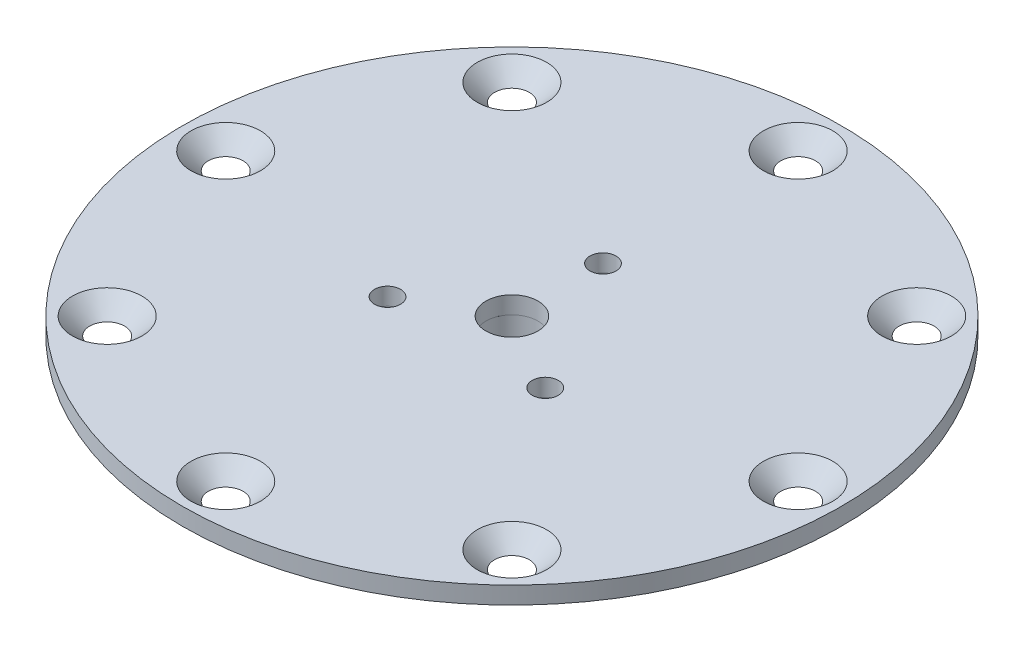
ISO-10303-21;
HEADER;
FILE_DESCRIPTION(('STEP AP214'),'2;1');
FILE_NAME('part.step','',(''),(''),'','','');
FILE_SCHEMA(('AUTOMOTIVE_DESIGN { 1 0 10303 214 1 1 1 1 }'));
ENDSEC;
DATA;
#1=APPLICATION_CONTEXT('core data for automotive mechanical design processes');
#2=APPLICATION_PROTOCOL_DEFINITION('international standard','automotive_design',2000,#1);
#3=PRODUCT_CONTEXT('',#1,'mechanical');
#4=PRODUCT('Part','Part','',(#3));
#5=PRODUCT_RELATED_PRODUCT_CATEGORY('part','',(#4));
#6=PRODUCT_DEFINITION_FORMATION('','',#4);
#7=PRODUCT_DEFINITION_CONTEXT('part definition',#1,'design');
#8=PRODUCT_DEFINITION('design','',#6,#7);
#9=PRODUCT_DEFINITION_SHAPE('','',#8);
#10=(LENGTH_UNIT() NAMED_UNIT(*) SI_UNIT(.MILLI.,.METRE.));
#11=(NAMED_UNIT(*) PLANE_ANGLE_UNIT() SI_UNIT($,.RADIAN.));
#12=(NAMED_UNIT(*) SI_UNIT($,.STERADIAN.) SOLID_ANGLE_UNIT());
#13=UNCERTAINTY_MEASURE_WITH_UNIT(LENGTH_MEASURE(1.E-05),#10,'distance_accuracy_value','');
#14=(GEOMETRIC_REPRESENTATION_CONTEXT(3) GLOBAL_UNCERTAINTY_ASSIGNED_CONTEXT((#13)) GLOBAL_UNIT_ASSIGNED_CONTEXT((#10,
#11,#12)) REPRESENTATION_CONTEXT('',''));
#15=CARTESIAN_POINT('',(0.,0.,0.));
#16=DIRECTION('',(0.,0.,1.));
#17=DIRECTION('',(1.,0.,0.));
#18=AXIS2_PLACEMENT_3D('',#15,#16,#17);
#19=CARTESIAN_POINT('',(0.,-7.23678090575275,0.));
#20=DIRECTION('',(0.,1.,0.));
#21=DIRECTION('',(0.,0.,1.));
#22=AXIS2_PLACEMENT_3D('',#19,#20,#21);
#23=PLANE('',#22);
#24=CARTESIAN_POINT('',(33.,-7.23678090575275,0.));
#25=DIRECTION('',(0.,1.,0.));
#26=DIRECTION('',(0.,0.,1.));
#27=AXIS2_PLACEMENT_3D('',#24,#25,#26);
#28=CIRCLE('',#27,4.00000000000002);
#29=CARTESIAN_POINT('',(33.,-7.23678090575275,4.00000000000002));
#30=VERTEX_POINT('',#29);
#31=EDGE_CURVE('E11',#30,#30,#28,.F.);
#32=ORIENTED_EDGE('',*,*,#31,.T.);
#33=EDGE_LOOP('',(#32));
#34=FACE_BOUND('',#33,.T.);
#35=CARTESIAN_POINT('',(23.3345237791561,-7.23678090575275,23.3345237791561));
#36=DIRECTION('',(0.,1.,0.));
#37=DIRECTION('',(0.,0.,1.));
#38=AXIS2_PLACEMENT_3D('',#35,#36,#37);
#39=CIRCLE('',#38,4.00000000000002);
#40=CARTESIAN_POINT('',(23.3345237791561,-7.23678090575275,27.3345237791561));
#41=VERTEX_POINT('',#40);
#42=EDGE_CURVE('E50',#41,#41,#39,.F.);
#43=ORIENTED_EDGE('',*,*,#42,.T.);
#44=EDGE_LOOP('',(#43));
#45=FACE_BOUND('',#44,.T.);
#46=CARTESIAN_POINT('',(0.,-7.23678090575275,33.));
#47=DIRECTION('',(0.,1.,0.));
#48=DIRECTION('',(0.,0.,1.));
#49=AXIS2_PLACEMENT_3D('',#46,#47,#48);
#50=CIRCLE('',#49,4.);
#51=CARTESIAN_POINT('',(0.,-7.23678090575275,37.));
#52=VERTEX_POINT('',#51);
#53=EDGE_CURVE('E54',#52,#52,#50,.F.);
#54=ORIENTED_EDGE('',*,*,#53,.T.);
#55=EDGE_LOOP('',(#54));
#56=FACE_BOUND('',#55,.T.);
#57=CARTESIAN_POINT('',(-23.3345237791561,-7.23678090575275,23.3345237791561));
#58=DIRECTION('',(0.,1.,0.));
#59=DIRECTION('',(0.,0.,1.));
#60=AXIS2_PLACEMENT_3D('',#57,#58,#59);
#61=CIRCLE('',#60,4.00000000000002);
#62=CARTESIAN_POINT('',(-23.3345237791561,-7.23678090575275,27.3345237791561));
#63=VERTEX_POINT('',#62);
#64=EDGE_CURVE('E58',#63,#63,#61,.F.);
#65=ORIENTED_EDGE('',*,*,#64,.T.);
#66=EDGE_LOOP('',(#65));
#67=FACE_BOUND('',#66,.T.);
#68=CARTESIAN_POINT('',(-33.,-7.23678090575275,0.));
#69=DIRECTION('',(0.,1.,0.));
#70=DIRECTION('',(0.,0.,1.));
#71=AXIS2_PLACEMENT_3D('',#68,#69,#70);
#72=CIRCLE('',#71,4.00000000000005);
#73=CARTESIAN_POINT('',(-33.,-7.23678090575275,4.00000000000004));
#74=VERTEX_POINT('',#73);
#75=EDGE_CURVE('E63',#74,#74,#72,.F.);
#76=ORIENTED_EDGE('',*,*,#75,.T.);
#77=EDGE_LOOP('',(#76));
#78=FACE_BOUND('',#77,.T.);
#79=CARTESIAN_POINT('',(-23.3345237791561,-7.23678090575275,-23.3345237791561));
#80=DIRECTION('',(0.,1.,0.));
#81=DIRECTION('',(0.,0.,1.));
#82=AXIS2_PLACEMENT_3D('',#79,#80,#81);
#83=CIRCLE('',#82,4.00000000000005);
#84=CARTESIAN_POINT('',(-23.3345237791561,-7.23678090575275,-19.334523779156));
#85=VERTEX_POINT('',#84);
#86=EDGE_CURVE('E66',#85,#85,#83,.F.);
#87=ORIENTED_EDGE('',*,*,#86,.T.);
#88=EDGE_LOOP('',(#87));
#89=FACE_BOUND('',#88,.T.);
#90=CARTESIAN_POINT('',(0.,-7.23678090575275,-33.));
#91=DIRECTION('',(0.,1.,0.));
#92=DIRECTION('',(0.,0.,1.));
#93=AXIS2_PLACEMENT_3D('',#90,#91,#92);
#94=CIRCLE('',#93,4.00000000000005);
#95=CARTESIAN_POINT('',(0.,-7.23678090575275,-29.));
#96=VERTEX_POINT('',#95);
#97=EDGE_CURVE('E69',#96,#96,#94,.F.);
#98=ORIENTED_EDGE('',*,*,#97,.T.);
#99=EDGE_LOOP('',(#98));
#100=FACE_BOUND('',#99,.T.);
#101=CARTESIAN_POINT('',(23.3345237791561,-7.23678090575275,-23.3345237791561));
#102=DIRECTION('',(0.,1.,0.));
#103=DIRECTION('',(0.,0.,1.));
#104=AXIS2_PLACEMENT_3D('',#101,#102,#103);
#105=CIRCLE('',#104,4.00000000000002);
#106=CARTESIAN_POINT('',(23.3345237791561,-7.23678090575275,-19.3345237791561));
#107=VERTEX_POINT('',#106);
#108=EDGE_CURVE('E72',#107,#107,#105,.F.);
#109=ORIENTED_EDGE('',*,*,#108,.T.);
#110=EDGE_LOOP('',(#109));
#111=FACE_BOUND('',#110,.T.);
#112=CARTESIAN_POINT('',(-9.09326673973658,-7.23678090575275,5.25000000000004));
#113=DIRECTION('',(0.,1.,0.));
#114=DIRECTION('',(0.,0.,1.));
#115=AXIS2_PLACEMENT_3D('',#112,#113,#114);
#116=CIRCLE('',#115,1.5);
#117=CARTESIAN_POINT('',(-9.09326673973658,-7.23678090575275,6.75000000000005));
#118=VERTEX_POINT('',#117);
#119=EDGE_CURVE('E91',#118,#118,#116,.T.);
#120=ORIENTED_EDGE('',*,*,#119,.F.);
#121=EDGE_LOOP('',(#120));
#122=FACE_BOUND('',#121,.T.);
#123=CARTESIAN_POINT('',(0.,-7.23678090575275,-10.5));
#124=DIRECTION('',(0.,1.,0.));
#125=DIRECTION('',(0.,0.,1.));
#126=AXIS2_PLACEMENT_3D('',#123,#124,#125);
#127=CIRCLE('',#126,1.5);
#128=CARTESIAN_POINT('',(0.,-7.23678090575275,-9.));
#129=VERTEX_POINT('',#128);
#130=EDGE_CURVE('E79',#129,#129,#127,.T.);
#131=ORIENTED_EDGE('',*,*,#130,.F.);
#132=EDGE_LOOP('',(#131));
#133=FACE_BOUND('',#132,.T.);
#134=CARTESIAN_POINT('',(0.,-7.23678090575275,0.));
#135=DIRECTION('',(0.,1.,0.));
#136=DIRECTION('',(0.,0.,1.));
#137=AXIS2_PLACEMENT_3D('',#134,#135,#136);
#138=CIRCLE('',#137,38.);
#139=CARTESIAN_POINT('',(0.,-7.23678090575275,38.));
#140=VERTEX_POINT('',#139);
#141=EDGE_CURVE('E75',#140,#140,#138,.T.);
#142=ORIENTED_EDGE('',*,*,#141,.T.);
#143=EDGE_LOOP('',(#142));
#144=FACE_BOUND('',#143,.T.);
#145=CARTESIAN_POINT('',(9.09326673973662,-7.23678090575275,5.24999999999998));
#146=DIRECTION('',(0.,1.,0.));
#147=DIRECTION('',(0.,0.,1.));
#148=AXIS2_PLACEMENT_3D('',#145,#146,#147);
#149=CIRCLE('',#148,1.5);
#150=CARTESIAN_POINT('',(9.09326673973662,-7.23678090575275,6.74999999999998));
#151=VERTEX_POINT('',#150);
#152=EDGE_CURVE('E85',#151,#151,#149,.T.);
#153=ORIENTED_EDGE('',*,*,#152,.F.);
#154=EDGE_LOOP('',(#153));
#155=FACE_BOUND('',#154,.T.);
#156=CARTESIAN_POINT('',(0.,-7.23678090575275,0.));
#157=DIRECTION('',(0.,1.,0.));
#158=DIRECTION('',(0.,0.,1.));
#159=AXIS2_PLACEMENT_3D('',#156,#157,#158);
#160=CIRCLE('',#159,3.);
#161=CARTESIAN_POINT('',(0.,-7.23678090575275,3.));
#162=VERTEX_POINT('',#161);
#163=EDGE_CURVE('E97',#162,#162,#160,.T.);
#164=ORIENTED_EDGE('',*,*,#163,.F.);
#165=EDGE_LOOP('',(#164));
#166=FACE_BOUND('',#165,.T.);
#167=ADVANCED_FACE('F43',(#34,#45,#56,#67,#78,#89,#100,#111,#122,#133,#144,#155,#166),#23,.T.);
#168=CARTESIAN_POINT('',(0.,-9.23678090575275,0.));
#169=DIRECTION('',(0.,1.,0.));
#170=DIRECTION('',(0.,0.,1.));
#171=AXIS2_PLACEMENT_3D('',#168,#169,#170);
#172=PLANE('',#171);
#173=CARTESIAN_POINT('',(0.,-9.23678090575275,0.));
#174=DIRECTION('',(0.,1.,0.));
#175=DIRECTION('',(0.,0.,1.));
#176=AXIS2_PLACEMENT_3D('',#173,#174,#175);
#177=CIRCLE('',#176,38.);
#178=CARTESIAN_POINT('',(0.,-9.23678090575275,38.));
#179=VERTEX_POINT('',#178);
#180=EDGE_CURVE('E76',#179,#179,#177,.T.);
#181=ORIENTED_EDGE('',*,*,#180,.F.);
#182=EDGE_LOOP('',(#181));
#183=FACE_BOUND('',#182,.T.);
#184=CARTESIAN_POINT('',(0.,-9.23678090575275,-10.5));
#185=DIRECTION('',(0.,1.,0.));
#186=DIRECTION('',(0.,0.,1.));
#187=AXIS2_PLACEMENT_3D('',#184,#185,#186);
#188=CIRCLE('',#187,1.5);
#189=CARTESIAN_POINT('',(0.,-9.23678090575275,-9.));
#190=VERTEX_POINT('',#189);
#191=EDGE_CURVE('E82',#190,#190,#188,.T.);
#192=ORIENTED_EDGE('',*,*,#191,.T.);
#193=EDGE_LOOP('',(#192));
#194=FACE_BOUND('',#193,.T.);
#195=CARTESIAN_POINT('',(9.09326673973662,-9.23678090575275,5.24999999999998));
#196=DIRECTION('',(0.,1.,0.));
#197=DIRECTION('',(0.,0.,1.));
#198=AXIS2_PLACEMENT_3D('',#195,#196,#197);
#199=CIRCLE('',#198,1.5);
#200=CARTESIAN_POINT('',(9.09326673973662,-9.23678090575275,6.74999999999998));
#201=VERTEX_POINT('',#200);
#202=EDGE_CURVE('E88',#201,#201,#199,.T.);
#203=ORIENTED_EDGE('',*,*,#202,.T.);
#204=EDGE_LOOP('',(#203));
#205=FACE_BOUND('',#204,.T.);
#206=CARTESIAN_POINT('',(-9.09326673973658,-9.23678090575275,5.25000000000004));
#207=DIRECTION('',(0.,1.,0.));
#208=DIRECTION('',(0.,0.,1.));
#209=AXIS2_PLACEMENT_3D('',#206,#207,#208);
#210=CIRCLE('',#209,1.5);
#211=CARTESIAN_POINT('',(-9.09326673973658,-9.23678090575275,6.75000000000005));
#212=VERTEX_POINT('',#211);
#213=EDGE_CURVE('E94',#212,#212,#210,.T.);
#214=ORIENTED_EDGE('',*,*,#213,.T.);
#215=EDGE_LOOP('',(#214));
#216=FACE_BOUND('',#215,.T.);
#217=CARTESIAN_POINT('',(0.,-9.23678090575275,0.));
#218=DIRECTION('',(0.,1.,0.));
#219=DIRECTION('',(0.,0.,1.));
#220=AXIS2_PLACEMENT_3D('',#217,#218,#219);
#221=CIRCLE('',#220,3.);
#222=CARTESIAN_POINT('',(0.,-9.23678090575275,3.));
#223=VERTEX_POINT('',#222);
#224=EDGE_CURVE('E100',#223,#223,#221,.T.);
#225=ORIENTED_EDGE('',*,*,#224,.T.);
#226=EDGE_LOOP('',(#225));
#227=FACE_BOUND('',#226,.T.);
#228=CARTESIAN_POINT('',(33.,-9.23678090575275,0.));
#229=DIRECTION('',(0.,1.,0.));
#230=DIRECTION('',(0.,0.,1.));
#231=AXIS2_PLACEMENT_3D('',#228,#229,#230);
#232=CIRCLE('',#231,2.);
#233=CARTESIAN_POINT('',(33.,-9.23678090575275,2.));
#234=VERTEX_POINT('',#233);
#235=EDGE_CURVE('E103',#234,#234,#232,.T.);
#236=ORIENTED_EDGE('',*,*,#235,.T.);
#237=EDGE_LOOP('',(#236));
#238=FACE_BOUND('',#237,.T.);
#239=CARTESIAN_POINT('',(23.3345237791561,-9.23678090575275,23.3345237791561));
#240=DIRECTION('',(0.,1.,0.));
#241=DIRECTION('',(0.,0.,1.));
#242=AXIS2_PLACEMENT_3D('',#239,#240,#241);
#243=CIRCLE('',#242,2.00000000000001);
#244=CARTESIAN_POINT('',(23.3345237791561,-9.23678090575275,25.3345237791561));
#245=VERTEX_POINT('',#244);
#246=EDGE_CURVE('E108',#245,#245,#243,.T.);
#247=ORIENTED_EDGE('',*,*,#246,.T.);
#248=EDGE_LOOP('',(#247));
#249=FACE_BOUND('',#248,.T.);
#250=CARTESIAN_POINT('',(0.,-9.23678090575275,33.));
#251=DIRECTION('',(0.,1.,0.));
#252=DIRECTION('',(0.,0.,1.));
#253=AXIS2_PLACEMENT_3D('',#250,#251,#252);
#254=CIRCLE('',#253,2.);
#255=CARTESIAN_POINT('',(0.,-9.23678090575275,35.));
#256=VERTEX_POINT('',#255);
#257=EDGE_CURVE('E111',#256,#256,#254,.T.);
#258=ORIENTED_EDGE('',*,*,#257,.T.);
#259=EDGE_LOOP('',(#258));
#260=FACE_BOUND('',#259,.T.);
#261=CARTESIAN_POINT('',(-23.3345237791561,-9.23678090575275,23.3345237791561));
#262=DIRECTION('',(0.,1.,0.));
#263=DIRECTION('',(0.,0.,1.));
#264=AXIS2_PLACEMENT_3D('',#261,#262,#263);
#265=CIRCLE('',#264,2.00000000000001);
#266=CARTESIAN_POINT('',(-23.3345237791561,-9.23678090575275,25.3345237791561));
#267=VERTEX_POINT('',#266);
#268=EDGE_CURVE('E114',#267,#267,#265,.T.);
#269=ORIENTED_EDGE('',*,*,#268,.T.);
#270=EDGE_LOOP('',(#269));
#271=FACE_BOUND('',#270,.T.);
#272=CARTESIAN_POINT('',(-33.,-9.23678090575275,0.));
#273=DIRECTION('',(0.,1.,0.));
#274=DIRECTION('',(0.,0.,1.));
#275=AXIS2_PLACEMENT_3D('',#272,#273,#274);
#276=CIRCLE('',#275,2.00000000000001);
#277=CARTESIAN_POINT('',(-33.,-9.23678090575275,2.00000000000001));
#278=VERTEX_POINT('',#277);
#279=EDGE_CURVE('E117',#278,#278,#276,.T.);
#280=ORIENTED_EDGE('',*,*,#279,.T.);
#281=EDGE_LOOP('',(#280));
#282=FACE_BOUND('',#281,.T.);
#283=CARTESIAN_POINT('',(-23.3345237791561,-9.23678090575275,-23.3345237791561));
#284=DIRECTION('',(0.,1.,0.));
#285=DIRECTION('',(0.,0.,1.));
#286=AXIS2_PLACEMENT_3D('',#283,#284,#285);
#287=CIRCLE('',#286,2.00000000000001);
#288=CARTESIAN_POINT('',(-23.3345237791561,-9.23678090575275,-21.3345237791561));
#289=VERTEX_POINT('',#288);
#290=EDGE_CURVE('E120',#289,#289,#287,.T.);
#291=ORIENTED_EDGE('',*,*,#290,.T.);
#292=EDGE_LOOP('',(#291));
#293=FACE_BOUND('',#292,.T.);
#294=CARTESIAN_POINT('',(0.,-9.23678090575275,-33.));
#295=DIRECTION('',(0.,1.,0.));
#296=DIRECTION('',(0.,0.,1.));
#297=AXIS2_PLACEMENT_3D('',#294,#295,#296);
#298=CIRCLE('',#297,2.00000000000001);
#299=CARTESIAN_POINT('',(0.,-9.23678090575275,-31.));
#300=VERTEX_POINT('',#299);
#301=EDGE_CURVE('E123',#300,#300,#298,.T.);
#302=ORIENTED_EDGE('',*,*,#301,.T.);
#303=EDGE_LOOP('',(#302));
#304=FACE_BOUND('',#303,.T.);
#305=CARTESIAN_POINT('',(23.3345237791561,-9.23678090575275,-23.3345237791561));
#306=DIRECTION('',(0.,1.,0.));
#307=DIRECTION('',(0.,0.,1.));
#308=AXIS2_PLACEMENT_3D('',#305,#306,#307);
#309=CIRCLE('',#308,2.);
#310=CARTESIAN_POINT('',(23.3345237791561,-9.23678090575275,-21.3345237791561));
#311=VERTEX_POINT('',#310);
#312=EDGE_CURVE('E126',#311,#311,#309,.T.);
#313=ORIENTED_EDGE('',*,*,#312,.T.);
#314=EDGE_LOOP('',(#313));
#315=FACE_BOUND('',#314,.T.);
#316=ADVANCED_FACE('F130',(#183,#194,#205,#216,#227,#238,#249,#260,#271,#282,#293,#304,#315),
#172,.F.);
#317=CARTESIAN_POINT('',(0.,-7.23678090575275,0.));
#318=DIRECTION('',(0.,-1.,0.));
#319=DIRECTION('',(0.,0.,-1.));
#320=AXIS2_PLACEMENT_3D('',#317,#318,#319);
#321=CYLINDRICAL_SURFACE('',#320,38.);
#322=ORIENTED_EDGE('',*,*,#141,.F.);
#323=EDGE_LOOP('',(#322));
#324=FACE_BOUND('',#323,.T.);
#325=ORIENTED_EDGE('',*,*,#180,.T.);
#326=EDGE_LOOP('',(#325));
#327=FACE_BOUND('',#326,.T.);
#328=ADVANCED_FACE('F146',(#324,#327),#321,.T.);
#329=CARTESIAN_POINT('',(0.,-7.23678090575275,-10.5));
#330=DIRECTION('',(0.,-1.,0.));
#331=DIRECTION('',(0.,0.,-1.));
#332=AXIS2_PLACEMENT_3D('',#329,#330,#331);
#333=CYLINDRICAL_SURFACE('',#332,1.5);
#334=ORIENTED_EDGE('',*,*,#130,.T.);
#335=EDGE_LOOP('',(#334));
#336=FACE_BOUND('',#335,.T.);
#337=ORIENTED_EDGE('',*,*,#191,.F.);
#338=EDGE_LOOP('',(#337));
#339=FACE_BOUND('',#338,.T.);
#340=ADVANCED_FACE('F150',(#336,#339),#333,.F.);
#341=CARTESIAN_POINT('',(9.09326673973662,-7.23678090575275,5.24999999999998));
#342=DIRECTION('',(0.,-1.,0.));
#343=DIRECTION('',(0.,0.,-1.));
#344=AXIS2_PLACEMENT_3D('',#341,#342,#343);
#345=CYLINDRICAL_SURFACE('',#344,1.5);
#346=ORIENTED_EDGE('',*,*,#152,.T.);
#347=EDGE_LOOP('',(#346));
#348=FACE_BOUND('',#347,.T.);
#349=ORIENTED_EDGE('',*,*,#202,.F.);
#350=EDGE_LOOP('',(#349));
#351=FACE_BOUND('',#350,.T.);
#352=ADVANCED_FACE('F227',(#348,#351),#345,.F.);
#353=CARTESIAN_POINT('',(-9.09326673973658,-7.23678090575275,5.25000000000004));
#354=DIRECTION('',(0.,-1.,0.));
#355=DIRECTION('',(0.,0.,-1.));
#356=AXIS2_PLACEMENT_3D('',#353,#354,#355);
#357=CYLINDRICAL_SURFACE('',#356,1.5);
#358=ORIENTED_EDGE('',*,*,#119,.T.);
#359=EDGE_LOOP('',(#358));
#360=FACE_BOUND('',#359,.T.);
#361=ORIENTED_EDGE('',*,*,#213,.F.);
#362=EDGE_LOOP('',(#361));
#363=FACE_BOUND('',#362,.T.);
#364=ADVANCED_FACE('F205',(#360,#363),#357,.F.);
#365=CARTESIAN_POINT('',(0.,-7.23678090575275,0.));
#366=DIRECTION('',(0.,-1.,0.));
#367=DIRECTION('',(0.,0.,-1.));
#368=AXIS2_PLACEMENT_3D('',#365,#366,#367);
#369=CYLINDRICAL_SURFACE('',#368,3.);
#370=ORIENTED_EDGE('',*,*,#163,.T.);
#371=EDGE_LOOP('',(#370));
#372=FACE_BOUND('',#371,.T.);
#373=ORIENTED_EDGE('',*,*,#224,.F.);
#374=EDGE_LOOP('',(#373));
#375=FACE_BOUND('',#374,.T.);
#376=ADVANCED_FACE('F160',(#372,#375),#369,.F.);
#377=CARTESIAN_POINT('',(33.,-9.23678090575276,0.));
#378=DIRECTION('',(0.,1.,0.));
#379=DIRECTION('',(0.,0.,1.));
#380=AXIS2_PLACEMENT_3D('',#377,#378,#379);
#381=CONICAL_SURFACE('',#380,2.,0.78539816339745);
#382=ORIENTED_EDGE('',*,*,#31,.F.);
#383=EDGE_LOOP('',(#382));
#384=FACE_BOUND('',#383,.T.);
#385=ORIENTED_EDGE('',*,*,#235,.F.);
#386=EDGE_LOOP('',(#385));
#387=FACE_BOUND('',#386,.T.);
#388=ADVANCED_FACE('F156',(#384,#387),#381,.F.);
#389=CARTESIAN_POINT('',(23.3345237791561,-9.23678090575275,23.3345237791561));
#390=DIRECTION('',(0.,1.,0.));
#391=DIRECTION('',(0.,0.,1.));
#392=AXIS2_PLACEMENT_3D('',#389,#390,#391);
#393=CONICAL_SURFACE('',#392,2.00000000000001,0.785398163397451);
#394=ORIENTED_EDGE('',*,*,#42,.F.);
#395=EDGE_LOOP('',(#394));
#396=FACE_BOUND('',#395,.T.);
#397=ORIENTED_EDGE('',*,*,#246,.F.);
#398=EDGE_LOOP('',(#397));
#399=FACE_BOUND('',#398,.T.);
#400=ADVANCED_FACE('F159',(#396,#399),#393,.F.);
#401=CARTESIAN_POINT('',(0.,-9.23678090575275,33.));
#402=DIRECTION('',(0.,1.,0.));
#403=DIRECTION('',(0.,0.,1.));
#404=AXIS2_PLACEMENT_3D('',#401,#402,#403);
#405=CONICAL_SURFACE('',#404,2.,0.78539816339745);
#406=ORIENTED_EDGE('',*,*,#53,.F.);
#407=EDGE_LOOP('',(#406));
#408=FACE_BOUND('',#407,.T.);
#409=ORIENTED_EDGE('',*,*,#257,.F.);
#410=EDGE_LOOP('',(#409));
#411=FACE_BOUND('',#410,.T.);
#412=ADVANCED_FACE('F164',(#408,#411),#405,.F.);
#413=CARTESIAN_POINT('',(-23.3345237791561,-9.23678090575275,23.3345237791561));
#414=DIRECTION('',(0.,1.,0.));
#415=DIRECTION('',(0.,0.,1.));
#416=AXIS2_PLACEMENT_3D('',#413,#414,#415);
#417=CONICAL_SURFACE('',#416,2.00000000000001,0.78539816339745);
#418=ORIENTED_EDGE('',*,*,#64,.F.);
#419=EDGE_LOOP('',(#418));
#420=FACE_BOUND('',#419,.T.);
#421=ORIENTED_EDGE('',*,*,#268,.F.);
#422=EDGE_LOOP('',(#421));
#423=FACE_BOUND('',#422,.T.);
#424=ADVANCED_FACE('F168',(#420,#423),#417,.F.);
#425=CARTESIAN_POINT('',(-33.,-9.23678090575278,0.));
#426=DIRECTION('',(0.,1.,0.));
#427=DIRECTION('',(0.,0.,1.));
#428=AXIS2_PLACEMENT_3D('',#425,#426,#427);
#429=CONICAL_SURFACE('',#428,2.00000000000001,0.78539816339745);
#430=ORIENTED_EDGE('',*,*,#75,.F.);
#431=EDGE_LOOP('',(#430));
#432=FACE_BOUND('',#431,.T.);
#433=ORIENTED_EDGE('',*,*,#279,.F.);
#434=EDGE_LOOP('',(#433));
#435=FACE_BOUND('',#434,.T.);
#436=ADVANCED_FACE('F172',(#432,#435),#429,.F.);
#437=CARTESIAN_POINT('',(-23.3345237791561,-9.23678090575278,-23.3345237791561));
#438=DIRECTION('',(0.,1.,0.));
#439=DIRECTION('',(0.,0.,1.));
#440=AXIS2_PLACEMENT_3D('',#437,#438,#439);
#441=CONICAL_SURFACE('',#440,2.00000000000001,0.785398163397451);
#442=ORIENTED_EDGE('',*,*,#86,.F.);
#443=EDGE_LOOP('',(#442));
#444=FACE_BOUND('',#443,.T.);
#445=ORIENTED_EDGE('',*,*,#290,.F.);
#446=EDGE_LOOP('',(#445));
#447=FACE_BOUND('',#446,.T.);
#448=ADVANCED_FACE('F138',(#444,#447),#441,.F.);
#449=CARTESIAN_POINT('',(0.,-9.23678090575278,-33.));
#450=DIRECTION('',(0.,1.,0.));
#451=DIRECTION('',(0.,0.,1.));
#452=AXIS2_PLACEMENT_3D('',#449,#450,#451);
#453=CONICAL_SURFACE('',#452,2.00000000000001,0.785398163397452);
#454=ORIENTED_EDGE('',*,*,#97,.F.);
#455=EDGE_LOOP('',(#454));
#456=FACE_BOUND('',#455,.T.);
#457=ORIENTED_EDGE('',*,*,#301,.F.);
#458=EDGE_LOOP('',(#457));
#459=FACE_BOUND('',#458,.T.);
#460=ADVANCED_FACE('F133',(#456,#459),#453,.F.);
#461=CARTESIAN_POINT('',(23.3345237791561,-9.23678090575276,-23.3345237791561));
#462=DIRECTION('',(0.,1.,0.));
#463=DIRECTION('',(0.,0.,1.));
#464=AXIS2_PLACEMENT_3D('',#461,#462,#463);
#465=CONICAL_SURFACE('',#464,2.,0.78539816339745);
#466=ORIENTED_EDGE('',*,*,#108,.F.);
#467=EDGE_LOOP('',(#466));
#468=FACE_BOUND('',#467,.T.);
#469=ORIENTED_EDGE('',*,*,#312,.F.);
#470=EDGE_LOOP('',(#469));
#471=FACE_BOUND('',#470,.T.);
#472=ADVANCED_FACE('F45',(#468,#471),#465,.F.);
#473=CLOSED_SHELL('',(#167,#316,#328,#340,#352,#364,#376,#388,#400,#412,#424,#436,#448,#460,#472));
#474=MANIFOLD_SOLID_BREP('B2',#473);
#475=CARTESIAN_POINT('',(0.,-25.2367809057528,0.));
#476=DIRECTION('',(0.,-1.,0.));
#477=DIRECTION('',(0.,0.,-1.));
#478=AXIS2_PLACEMENT_3D('',#475,#476,#477);
#479=CYLINDRICAL_SURFACE('',#478,3.);
#480=CARTESIAN_POINT('',(0.,-9.23678090575275,0.));
#481=DIRECTION('',(0.,-1.,0.));
#482=DIRECTION('',(0.,0.,-1.));
#483=AXIS2_PLACEMENT_3D('',#480,#481,#482);
#484=CIRCLE('',#483,3.);
#485=CARTESIAN_POINT('',(0.,-9.23678090575275,-3.));
#486=VERTEX_POINT('',#485);
#487=EDGE_CURVE('E348',#486,#486,#484,.T.);
#488=ORIENTED_EDGE('',*,*,#487,.F.);
#489=EDGE_LOOP('',(#488));
#490=FACE_BOUND('',#489,.T.);
#491=CARTESIAN_POINT('',(0.,-25.2367809057528,0.));
#492=DIRECTION('',(0.,-1.,0.));
#493=DIRECTION('',(0.,0.,-1.));
#494=AXIS2_PLACEMENT_3D('',#491,#492,#493);
#495=CIRCLE('',#494,3.);
#496=CARTESIAN_POINT('',(0.,-25.2367809057528,-3.));
#497=VERTEX_POINT('',#496);
#498=EDGE_CURVE('E42',#497,#497,#495,.T.);
#499=ORIENTED_EDGE('',*,*,#498,.T.);
#500=EDGE_LOOP('',(#499));
#501=FACE_BOUND('',#500,.T.);
#502=CARTESIAN_POINT('',(-2.,-17.2367809057528,2.23606797749979));
#503=CARTESIAN_POINT('',(-1.99999453997731,-17.1391525948841,2.23607753462817));
#504=CARTESIAN_POINT('',(-1.99278992503664,-17.0414901520439,2.24258071047442));
#505=CARTESIAN_POINT('',(-1.96458268317731,-16.8496609941019,2.26731972501617));
#506=CARTESIAN_POINT('',(-1.94355530587862,-16.7555008702232,2.2855766081271));
#507=CARTESIAN_POINT('',(-1.88935861676632,-16.5740454638751,2.3305658582557));
#508=CARTESIAN_POINT('',(-1.85630718014214,-16.4866932090151,2.35721561794602));
#509=CARTESIAN_POINT('',(-1.77934008393538,-16.3189150734061,2.41584094681825));
#510=CARTESIAN_POINT('',(-1.73542216812163,-16.2384906357763,2.44781762158831));
#511=CARTESIAN_POINT('',(-1.63002410007714,-16.0731340181358,2.51946072932026));
#512=CARTESIAN_POINT('',(-1.56687435451732,-15.9894487880356,2.55954936090364));
#513=CARTESIAN_POINT('',(-1.4281921974068,-15.8327781968785,2.63944827308083));
#514=CARTESIAN_POINT('',(-1.3526477317708,-15.7598033840942,2.67925824297985));
#515=CARTESIAN_POINT('',(-1.17815690494295,-15.6161372469711,2.76088818523747));
#516=CARTESIAN_POINT('',(-1.07740643965819,-15.5472983939771,2.80216785846923));
#517=CARTESIAN_POINT('',(-0.862470964212233,-15.4281388102627,2.87558484482764));
#518=CARTESIAN_POINT('',(-0.748301152321704,-15.3777973917216,2.90773236231037));
#519=CARTESIAN_POINT('',(-0.523249073480004,-15.3032245047353,2.95599907464725));
#520=CARTESIAN_POINT('',(-0.413434725181417,-15.2766975612572,2.97351175615867));
#521=CARTESIAN_POINT('',(-0.189695448729863,-15.2425964164691,2.99609745461921));
#522=CARTESIAN_POINT('',(-0.0757758812858258,-15.2349983465273,3.00118613762359));
#523=CARTESIAN_POINT('',(0.134147050232329,-15.2389533557018,2.99855361722953));
#524=CARTESIAN_POINT('',(0.230240638008752,-15.2477699570698,2.99266264910127));
#525=CARTESIAN_POINT('',(0.419238633271014,-15.2788719571117,2.9720818279002));
#526=CARTESIAN_POINT('',(0.512142807649723,-15.3011583380563,2.95739133313102));
#527=CARTESIAN_POINT('',(0.692077937671168,-15.3579765905473,2.92052091703736));
#528=CARTESIAN_POINT('',(0.779130623845961,-15.3924597909513,2.89837077982679));
#529=CARTESIAN_POINT('',(0.946209150653556,-15.4723345487056,2.84821104476287));
#530=CARTESIAN_POINT('',(1.0262337049694,-15.5177280972543,2.82020037745161));
#531=CARTESIAN_POINT('',(1.18828429196344,-15.6247596432126,2.75618058450702));
#532=CARTESIAN_POINT('',(1.26919148099708,-15.6877484291055,2.71960408792025));
#533=CARTESIAN_POINT('',(1.41998807498305,-15.8246795852331,2.64400601826998));
#534=CARTESIAN_POINT('',(1.48986013519457,-15.8986388516866,2.60498072815232));
#535=CARTESIAN_POINT('',(1.62772235326165,-16.068744115966,2.52150044944152));
#536=CARTESIAN_POINT('',(1.69373593126354,-16.1665519854672,2.47714320008932));
#537=CARTESIAN_POINT('',(1.80834874945482,-16.3742907449735,2.39475610831095));
#538=CARTESIAN_POINT('',(1.85697718654898,-16.4842009001666,2.3567157153489));
#539=CARTESIAN_POINT('',(1.92332724567776,-16.6814999678259,2.30262870306889));
#540=CARTESIAN_POINT('',(1.94590791747533,-16.7663742758096,2.28340364577668));
#541=CARTESIAN_POINT('',(1.97979555580014,-16.9398203955696,2.25409039789612));
#542=CARTESIAN_POINT('',(1.99112206964395,-17.0283855169254,2.24398636782354));
#543=CARTESIAN_POINT('',(2.00179400148877,-17.2072238921942,2.23447556987372));
#544=CARTESIAN_POINT('',(2.00108729753098,-17.2975028842729,2.2351153386647));
#545=CARTESIAN_POINT('',(1.98761629716365,-17.4764647397078,2.24709880368953));
#546=CARTESIAN_POINT('',(1.97484222690381,-17.5651462498601,2.25845117648851));
#547=CARTESIAN_POINT('',(1.93899811187046,-17.7341703233026,2.28927977500746));
#548=CARTESIAN_POINT('',(1.91646174529973,-17.8147086147553,2.30833187069749));
#549=CARTESIAN_POINT('',(1.86223041628513,-17.970907141803,2.3522995853365));
#550=CARTESIAN_POINT('',(1.83053237805351,-18.0465657287158,2.3772171729463));
#551=CARTESIAN_POINT('',(1.75163346599563,-18.2069829096003,2.43611483596194));
#552=CARTESIAN_POINT('',(1.70260028818246,-18.2905377172954,2.47091081434316));
#553=CARTESIAN_POINT('',(1.59352731501438,-18.44919770837,2.54262514806633));
#554=CARTESIAN_POINT('',(1.53347411883827,-18.5242924224952,2.57954604947543));
#555=CARTESIAN_POINT('',(1.38876657712435,-18.6807432532203,2.66075678321007));
#556=CARTESIAN_POINT('',(1.30160386514207,-18.7598837540011,2.70489452138573));
#557=CARTESIAN_POINT('',(1.11309948866219,-18.902597588693,2.78775581841638));
#558=CARTESIAN_POINT('',(1.011770477457,-18.9661846770095,2.82648414789457));
#559=CARTESIAN_POINT('',(0.817487474821797,-19.0646726446703,2.88790821242222));
#560=CARTESIAN_POINT('',(0.72666236488632,-19.1027374101931,2.91225458111008));
#561=CARTESIAN_POINT('',(0.538757079020515,-19.1653881000732,2.95278707867041));
#562=CARTESIAN_POINT('',(0.441682263858769,-19.1899854086125,2.96898009871993));
#563=CARTESIAN_POINT('',(0.243369392303443,-19.2244778695915,2.99178364026746));
#564=CARTESIAN_POINT('',(0.142114836924318,-19.2343075852594,2.99835150856533));
#565=CARTESIAN_POINT('',(-0.0608555465807322,-19.2384287571699,3.00109821029056));
#566=CARTESIAN_POINT('',(-0.162571330953448,-19.2327216577089,2.99727800938901));
#567=CARTESIAN_POINT('',(-0.355757532528105,-19.207121416748,2.98029555977323));
#568=CARTESIAN_POINT('',(-0.447435143070529,-19.1882899208909,2.96783277209856));
#569=CARTESIAN_POINT('',(-0.626018422997061,-19.1385428963219,2.93536106206933));
#570=CARTESIAN_POINT('',(-0.71292334868689,-19.1076254904055,2.91535096747103));
#571=CARTESIAN_POINT('',(-0.88514729660835,-19.0328422008687,2.86791765486194));
#572=CARTESIAN_POINT('',(-0.970083589200263,-18.9883305982577,2.84013248946338));
#573=CARTESIAN_POINT('',(-1.13155266268318,-18.8886302611268,2.77975408235472));
#574=CARTESIAN_POINT('',(-1.20808037205002,-18.8334351378008,2.74715796645263));
#575=CARTESIAN_POINT('',(-1.36329422201402,-18.7041520034164,2.67392931472394));
#576=CARTESIAN_POINT('',(-1.44042679526091,-18.6284578820787,2.6328391387737));
#577=CARTESIAN_POINT('',(-1.58160022281596,-18.4656673642069,2.55053357649486));
#578=CARTESIAN_POINT('',(-1.64563128323923,-18.3785625169187,2.50931811970155));
#579=CARTESIAN_POINT('',(-1.75513253518411,-18.2009133149975,2.43384213590298));
#580=CARTESIAN_POINT('',(-1.8016464689721,-18.1111390958024,2.39929086741904));
#581=CARTESIAN_POINT('',(-1.88115802340272,-17.9234964567596,2.33747501591022));
#582=CARTESIAN_POINT('',(-1.91418190281333,-17.8256442118906,2.31019631295305));
#583=CARTESIAN_POINT('',(-1.95936262470908,-17.6460094373282,2.27191051929539));
#584=CARTESIAN_POINT('',(-1.97452228373248,-17.5654726689625,2.25863695410151));
#585=CARTESIAN_POINT('',(-1.99483915818926,-17.4022245052482,2.24071519216009));
#586=CARTESIAN_POINT('',(-2.00000462703715,-17.3195149614922,2.23605987841475));
#587=CARTESIAN_POINT('',(-2.,-17.2367809057528,2.23606797749979));
#588=B_SPLINE_CURVE_WITH_KNOTS('',3,(#502,#503,#504,#505,#506,#507,#508,#509,#510,#511,#512,
#513,#514,#515,#516,#517,#518,#519,#520,#521,#522,#523,#524,#525,#526,#527,#528,#529,#530,#531,
#532,#533,#534,#535,#536,#537,#538,#539,#540,#541,#542,#543,#544,#545,#546,#547,#548,#549,#550,
#551,#552,#553,#554,#555,#556,#557,#558,#559,#560,#561,#562,#563,#564,#565,#566,#567,#568,#569,
#570,#571,#572,#573,#574,#575,#576,#577,#578,#579,#580,#581,#582,#583,#584,#585,#586,#587),
.UNSPECIFIED.,.T.,.F.,(4,2,2,2,2,2,2,2,2,2,2,2,2,2,2,2,2,2,2,2,2,2,2,2,2,2,2,2,2,2,2,2,2,2,2,2,
2,2,2,2,2,2,4),(0.,0.292506930722154,0.585539042259288,0.875772651216276,1.16606657266549,
1.50154677068638,1.83735518436275,2.22167031006289,2.6055542938858,2.94637482063579,
3.28676536688298,3.57539534955742,3.86404638283746,4.15155831973191,4.43912276903,
4.76447525946635,5.09033414796638,5.46678703504944,5.84260469743948,6.11126090401324,
6.37944966235486,6.64880037638036,6.91836943570598,7.17476451706936,7.43124577644957,
7.73899230052351,8.04711556801509,8.42254684520963,8.7976449057258,9.10070580611698,
9.40351012888472,9.70765229266164,10.0117661844615,10.2937678224973,10.5758132789284,
10.874178629859,11.1727229593109,11.5182220628451,11.863978504186,12.1833412579672,
12.5020793664923,12.7501661630426,12.9980479966543),.UNSPECIFIED.);
#589=CARTESIAN_POINT('',(-2.,-17.2367809057528,2.23606797749979));
#590=VERTEX_POINT('',#589);
#591=EDGE_CURVE('E401',#590,#590,#588,.T.);
#592=ORIENTED_EDGE('',*,*,#591,.F.);
#593=EDGE_LOOP('',(#592));
#594=FACE_BOUND('',#593,.T.);
#595=ADVANCED_FACE('F336',(#490,#501,#594),#479,.F.);
#596=CARTESIAN_POINT('',(0.,-25.2367809057528,0.));
#597=DIRECTION('',(0.,-1.,0.));
#598=DIRECTION('',(0.,0.,-1.));
#599=AXIS2_PLACEMENT_3D('',#596,#597,#598);
#600=CYLINDRICAL_SURFACE('',#599,7.5);
#601=CARTESIAN_POINT('',(0.,-25.2367809057528,0.));
#602=DIRECTION('',(0.,-1.,0.));
#603=DIRECTION('',(0.,0.,-1.));
#604=AXIS2_PLACEMENT_3D('',#601,#602,#603);
#605=CIRCLE('',#604,7.5);
#606=CARTESIAN_POINT('',(0.,-25.2367809057528,-7.5));
#607=VERTEX_POINT('',#606);
#608=EDGE_CURVE('E360',#607,#607,#605,.T.);
#609=ORIENTED_EDGE('',*,*,#608,.F.);
#610=EDGE_LOOP('',(#609));
#611=FACE_BOUND('',#610,.T.);
#612=CARTESIAN_POINT('',(0.,-13.2367809057528,0.));
#613=DIRECTION('',(0.,-1.,0.));
#614=DIRECTION('',(0.,0.,-1.));
#615=AXIS2_PLACEMENT_3D('',#612,#613,#614);
#616=CIRCLE('',#615,7.5);
#617=CARTESIAN_POINT('',(0.,-13.2367809057528,-7.5));
#618=VERTEX_POINT('',#617);
#619=EDGE_CURVE('E379',#618,#618,#616,.T.);
#620=ORIENTED_EDGE('',*,*,#619,.T.);
#621=EDGE_LOOP('',(#620));
#622=FACE_BOUND('',#621,.T.);
#623=CARTESIAN_POINT('',(-2.,-17.2367809057528,7.22841614740048));
#624=CARTESIAN_POINT('',(-1.99999734315871,-17.346956843493,7.22841805697252));
#625=CARTESIAN_POINT('',(-1.99086493224743,-17.4571609062288,7.23096264549673));
#626=CARTESIAN_POINT('',(-1.95464583260237,-17.6743863273091,7.24083561155097));
#627=CARTESIAN_POINT('',(-1.92755013620953,-17.7814060607308,7.24816638907934));
#628=CARTESIAN_POINT('',(-1.85635845560073,-17.9890889756995,7.26672375176839));
#629=CARTESIAN_POINT('',(-1.81228637542178,-18.0897608645812,7.27794485684204));
#630=CARTESIAN_POINT('',(-1.70846784563704,-18.2822976458126,7.30301154920401));
#631=CARTESIAN_POINT('',(-1.6487201784145,-18.3741618532597,7.31685734034424));
#632=CARTESIAN_POINT('',(-1.51364847874559,-18.5487734527405,7.34600139553467));
#633=CARTESIAN_POINT('',(-1.43800297504208,-18.6312679232172,7.36132541116443));
#634=CARTESIAN_POINT('',(-1.27397427284021,-18.7825624827039,7.39147701436507));
#635=CARTESIAN_POINT('',(-1.18558975534664,-18.8513611518945,7.40630455033439));
#636=CARTESIAN_POINT('',(-0.996838170873269,-18.9743658441557,7.43407988468418));
#637=CARTESIAN_POINT('',(-0.896301819879479,-19.0283204243856,7.44699376262293));
#638=CARTESIAN_POINT('',(-0.687183044729091,-19.11846554112,7.46919126211834));
#639=CARTESIAN_POINT('',(-0.578601980875103,-19.1546590730343,7.47847549576262));
#640=CARTESIAN_POINT('',(-0.35911596181009,-19.2074361259885,7.49218553576461));
#641=CARTESIAN_POINT('',(-0.248321224200916,-19.2244498823787,7.49671776750265));
#642=CARTESIAN_POINT('',(-0.0253635535085756,-19.2397380258599,7.50078524617749));
#643=CARTESIAN_POINT('',(0.0867991474385298,-19.2380155493829,7.50032132946608));
#644=CARTESIAN_POINT('',(0.306314237111346,-19.2161830932133,7.49452675859765));
#645=CARTESIAN_POINT('',(0.41371660072111,-19.1965379481165,7.48931914026999));
#646=CARTESIAN_POINT('',(0.623641315571055,-19.1401687679708,7.4747674859047));
#647=CARTESIAN_POINT('',(0.72616338818058,-19.1034437590667,7.46542321400589));
#648=CARTESIAN_POINT('',(0.924603945147554,-19.0136010581604,7.44346569099892));
#649=CARTESIAN_POINT('',(1.02044668632954,-18.960324098652,7.43082087877672));
#650=CARTESIAN_POINT('',(1.20198999876452,-18.8390120862437,7.40362468509504));
#651=CARTESIAN_POINT('',(1.28768858808586,-18.7709741567246,7.38907293223));
#652=CARTESIAN_POINT('',(1.44928536946561,-18.6196040478188,7.35911272938719));
#653=CARTESIAN_POINT('',(1.52480192017774,-18.5358664607034,7.34369169368738));
#654=CARTESIAN_POINT('',(1.6608133210477,-18.3567562295139,7.31413405023521));
#655=CARTESIAN_POINT('',(1.72130725529808,-18.2613828765523,7.29999752083065));
#656=CARTESIAN_POINT('',(1.82584679186274,-18.0608808039314,7.27455902280777));
#657=CARTESIAN_POINT('',(1.86978866600526,-17.9556955548396,7.26327507092156));
#658=CARTESIAN_POINT('',(1.93924001685674,-17.7390544062978,7.24504325087515));
#659=CARTESIAN_POINT('',(1.96475406461341,-17.6276000693024,7.23809430746845));
#660=CARTESIAN_POINT('',(1.99596757092855,-17.4051536947244,7.22954835612976));
#661=CARTESIAN_POINT('',(2.00223632621177,-17.2942473571314,7.22779763213456));
#662=CARTESIAN_POINT('',(1.9963498112297,-17.0729711329442,7.22942578390815));
#663=CARTESIAN_POINT('',(1.98419650172323,-16.9626011905128,7.23280411376438));
#664=CARTESIAN_POINT('',(1.94231271869971,-16.7477243116612,7.24416124318865));
#665=CARTESIAN_POINT('',(1.91292447912922,-16.6431454678155,7.25205039699299));
#666=CARTESIAN_POINT('',(1.83778986725474,-16.4404012743928,7.27145268952784));
#667=CARTESIAN_POINT('',(1.79204135876651,-16.3422367643253,7.28296630148563));
#668=CARTESIAN_POINT('',(1.68432905508707,-16.1527259483175,7.30863572472984));
#669=CARTESIAN_POINT('',(1.62203095237924,-16.061576929863,7.32284404872864));
#670=CARTESIAN_POINT('',(1.48340227987515,-15.8908176040496,7.35217841933666));
#671=CARTESIAN_POINT('',(1.40706907222966,-15.8112094707986,7.36730463810238));
#672=CARTESIAN_POINT('',(1.23990378250484,-15.6634284325028,7.39729964884456));
#673=CARTESIAN_POINT('',(1.14871641600885,-15.5956525287742,7.41214836523848));
#674=CARTESIAN_POINT('',(0.955928435940744,-15.4763699183422,7.43946670017127));
#675=CARTESIAN_POINT('',(0.854328377018885,-15.4248623456738,7.45193644532905));
#676=CARTESIAN_POINT('',(0.644314134825873,-15.3400512733912,7.47301150899261));
#677=CARTESIAN_POINT('',(0.535957852882338,-15.3066118863093,7.48164558480385));
#678=CARTESIAN_POINT('',(0.314899384731321,-15.2584921776884,7.49420303787247));
#679=CARTESIAN_POINT('',(0.202198167320244,-15.2438076989781,7.4981274590498));
#680=CARTESIAN_POINT('',(-0.0206420013461493,-15.2338750820113,7.50077413437691));
#681=CARTESIAN_POINT('',(-0.130753511527864,-15.2380445866216,7.49965226288082));
#682=CARTESIAN_POINT('',(-0.348648304630718,-15.264349399328,7.4926849097886));
#683=CARTESIAN_POINT('',(-0.456431674812814,-15.2864840328698,7.48683960554786));
#684=CARTESIAN_POINT('',(-0.66591012346421,-15.3477615106714,7.47111310390923));
#685=CARTESIAN_POINT('',(-0.76764201185154,-15.3867861992252,7.46125997189229));
#686=CARTESIAN_POINT('',(-0.963172098471354,-15.480630507499,7.43854816516494));
#687=CARTESIAN_POINT('',(-1.05696918166215,-15.5354523423656,7.42568906899253));
#688=CARTESIAN_POINT('',(-1.23667826867367,-15.6610391778898,7.39791331224121));
#689=CARTESIAN_POINT('',(-1.32231336173331,-15.7321902864514,7.38295093371635));
#690=CARTESIAN_POINT('',(-1.48062537156133,-15.8876836551177,7.35284000077256));
#691=CARTESIAN_POINT('',(-1.55329887243048,-15.9720293815721,7.33769139839721));
#692=CARTESIAN_POINT('',(-1.68520700232562,-16.1537493015704,7.30853959638856));
#693=CARTESIAN_POINT('',(-1.74411094261233,-16.25136921941,7.29456891224646));
#694=CARTESIAN_POINT('',(-1.84458689030054,-16.455487216613,7.26981393903472));
#695=CARTESIAN_POINT('',(-1.88617023367332,-16.5619794342922,7.25902756724947));
#696=CARTESIAN_POINT('',(-1.94538124252481,-16.762862241804,7.24336000653874));
#697=CARTESIAN_POINT('',(-1.96581518399489,-16.8563821703095,7.23780140272195));
#698=CARTESIAN_POINT('',(-1.9931249429388,-17.0455214637467,7.2303288521157));
#699=CARTESIAN_POINT('',(-2.0000023063216,-17.1411405880416,7.22841448976016));
#700=CARTESIAN_POINT('',(-2.,-17.2367809057528,7.22841614740048));
#701=B_SPLINE_CURVE_WITH_KNOTS('',3,(#623,#624,#625,#626,#627,#628,#629,#630,#631,#632,#633,
#634,#635,#636,#637,#638,#639,#640,#641,#642,#643,#644,#645,#646,#647,#648,#649,#650,#651,#652,
#653,#654,#655,#656,#657,#658,#659,#660,#661,#662,#663,#664,#665,#666,#667,#668,#669,#670,#671,
#672,#673,#674,#675,#676,#677,#678,#679,#680,#681,#682,#683,#684,#685,#686,#687,#688,#689,#690,
#691,#692,#693,#694,#695,#696,#697,#698,#699,#700),.UNSPECIFIED.,.T.,.F.,(4,2,2,2,2,2,2,2,2,2,2,
2,2,2,2,2,2,2,2,2,2,2,2,2,2,2,2,2,2,2,2,2,2,2,2,2,2,2,4),(0.,0.330176128116026,
0.660517947850201,0.990396311596164,1.32030030656104,1.65765916130211,1.99505297124461,
2.33785207370803,2.68059334304246,3.0154830431648,3.35031668385603,3.67670570800803,
4.00311334440695,4.3327644890557,4.66247993394491,5.0023176230033,5.34217602639579,
5.68413015096536,6.02599942418508,6.35765334242023,6.68927196343503,7.01451850432574,
7.33980752864823,7.67224634967772,8.00474771541474,8.34685906959632,8.68895221008103,
9.028435395914,9.36784331959005,9.69684054916462,10.0258254261296,10.3525451486866,
10.6793107076596,11.0147885399158,11.3503546538105,11.6933003898558,12.0360213210131,
12.3226696767153,12.6092853429065),.UNSPECIFIED.);
#702=CARTESIAN_POINT('',(-2.,-17.2367809057528,7.22841614740048));
#703=VERTEX_POINT('',#702);
#704=EDGE_CURVE('E340',#703,#703,#701,.T.);
#705=ORIENTED_EDGE('',*,*,#704,.F.);
#706=EDGE_LOOP('',(#705));
#707=FACE_BOUND('',#706,.T.);
#708=ADVANCED_FACE('F397',(#611,#622,#707),#600,.T.);
#709=CARTESIAN_POINT('',(-7.5,-25.2367809057528,0.));
#710=DIRECTION('',(0.,1.,0.));
#711=DIRECTION('',(0.,0.,1.));
#712=AXIS2_PLACEMENT_3D('',#709,#710,#711);
#713=PLANE('',#712);
#714=ORIENTED_EDGE('',*,*,#498,.F.);
#715=EDGE_LOOP('',(#714));
#716=FACE_BOUND('',#715,.T.);
#717=ORIENTED_EDGE('',*,*,#608,.T.);
#718=EDGE_LOOP('',(#717));
#719=FACE_BOUND('',#718,.T.);
#720=ADVANCED_FACE('F338',(#716,#719),#713,.F.);
#721=CARTESIAN_POINT('',(-3.,-9.23678090575275,0.));
#722=DIRECTION('',(0.,-1.,0.));
#723=DIRECTION('',(0.,0.,-1.));
#724=AXIS2_PLACEMENT_3D('',#721,#722,#723);
#725=PLANE('',#724);
#726=CARTESIAN_POINT('',(-9.09326673973658,-9.23678090575275,5.25000000000004));
#727=DIRECTION('',(0.,1.,0.));
#728=DIRECTION('',(0.,0.,1.));
#729=AXIS2_PLACEMENT_3D('',#726,#727,#728);
#730=CIRCLE('',#729,1.5);
#731=CARTESIAN_POINT('',(-9.09326673973658,-9.23678090575275,6.75000000000004));
#732=VERTEX_POINT('',#731);
#733=EDGE_CURVE('E365',#732,#732,#730,.T.);
#734=ORIENTED_EDGE('',*,*,#733,.F.);
#735=EDGE_LOOP('',(#734));
#736=FACE_BOUND('',#735,.T.);
#737=CARTESIAN_POINT('',(0.,-9.23678090575275,-10.5));
#738=DIRECTION('',(0.,1.,0.));
#739=DIRECTION('',(0.,0.,1.));
#740=AXIS2_PLACEMENT_3D('',#737,#738,#739);
#741=CIRCLE('',#740,1.5);
#742=CARTESIAN_POINT('',(0.,-9.23678090575275,-9.));
#743=VERTEX_POINT('',#742);
#744=EDGE_CURVE('E375',#743,#743,#741,.T.);
#745=ORIENTED_EDGE('',*,*,#744,.F.);
#746=EDGE_LOOP('',(#745));
#747=FACE_BOUND('',#746,.T.);
#748=CARTESIAN_POINT('',(9.09326673973662,-9.23678090575275,5.24999999999998));
#749=DIRECTION('',(0.,1.,0.));
#750=DIRECTION('',(0.,0.,1.));
#751=AXIS2_PLACEMENT_3D('',#748,#749,#750);
#752=CIRCLE('',#751,1.5);
#753=CARTESIAN_POINT('',(9.09326673973662,-9.23678090575275,6.74999999999998));
#754=VERTEX_POINT('',#753);
#755=EDGE_CURVE('E361',#754,#754,#752,.T.);
#756=ORIENTED_EDGE('',*,*,#755,.F.);
#757=EDGE_LOOP('',(#756));
#758=FACE_BOUND('',#757,.T.);
#759=CARTESIAN_POINT('',(0.,-9.23678090575275,0.));
#760=DIRECTION('',(0.,-1.,0.));
#761=DIRECTION('',(0.,0.,-1.));
#762=AXIS2_PLACEMENT_3D('',#759,#760,#761);
#763=CIRCLE('',#762,14.);
#764=CARTESIAN_POINT('',(0.,-9.23678090575275,-14.));
#765=VERTEX_POINT('',#764);
#766=EDGE_CURVE('E353',#765,#765,#763,.T.);
#767=ORIENTED_EDGE('',*,*,#766,.F.);
#768=EDGE_LOOP('',(#767));
#769=FACE_BOUND('',#768,.T.);
#770=ORIENTED_EDGE('',*,*,#487,.T.);
#771=EDGE_LOOP('',(#770));
#772=FACE_BOUND('',#771,.T.);
#773=ADVANCED_FACE('F389',(#736,#747,#758,#769,#772),#725,.F.);
#774=CARTESIAN_POINT('',(0.,-25.2367809057528,0.));
#775=DIRECTION('',(0.,-1.,0.));
#776=DIRECTION('',(0.,0.,-1.));
#777=AXIS2_PLACEMENT_3D('',#774,#775,#776);
#778=CYLINDRICAL_SURFACE('',#777,14.);
#779=CARTESIAN_POINT('',(0.,-13.2367809057528,0.));
#780=DIRECTION('',(0.,-1.,0.));
#781=DIRECTION('',(0.,0.,-1.));
#782=AXIS2_PLACEMENT_3D('',#779,#780,#781);
#783=CIRCLE('',#782,14.);
#784=CARTESIAN_POINT('',(0.,-13.2367809057528,-14.));
#785=VERTEX_POINT('',#784);
#786=EDGE_CURVE('E382',#785,#785,#783,.T.);
#787=ORIENTED_EDGE('',*,*,#786,.F.);
#788=EDGE_LOOP('',(#787));
#789=FACE_BOUND('',#788,.T.);
#790=ORIENTED_EDGE('',*,*,#766,.T.);
#791=EDGE_LOOP('',(#790));
#792=FACE_BOUND('',#791,.T.);
#793=ADVANCED_FACE('F387',(#789,#792),#778,.T.);
#794=CARTESIAN_POINT('',(-14.,-13.2367809057528,0.));
#795=DIRECTION('',(0.,1.,0.));
#796=DIRECTION('',(0.,0.,1.));
#797=AXIS2_PLACEMENT_3D('',#794,#795,#796);
#798=PLANE('',#797);
#799=CARTESIAN_POINT('',(-9.09326673973658,-13.2367809057528,5.25000000000004));
#800=DIRECTION('',(0.,1.,0.));
#801=DIRECTION('',(0.,0.,1.));
#802=AXIS2_PLACEMENT_3D('',#799,#800,#801);
#803=CIRCLE('',#802,1.5);
#804=CARTESIAN_POINT('',(-9.09326673973658,-13.2367809057528,6.75000000000004));
#805=VERTEX_POINT('',#804);
#806=EDGE_CURVE('E364',#805,#805,#803,.T.);
#807=ORIENTED_EDGE('',*,*,#806,.T.);
#808=EDGE_LOOP('',(#807));
#809=FACE_BOUND('',#808,.T.);
#810=CARTESIAN_POINT('',(0.,-13.2367809057528,-10.5));
#811=DIRECTION('',(0.,1.,0.));
#812=DIRECTION('',(0.,0.,1.));
#813=AXIS2_PLACEMENT_3D('',#810,#811,#812);
#814=CIRCLE('',#813,1.5);
#815=CARTESIAN_POINT('',(0.,-13.2367809057528,-9.));
#816=VERTEX_POINT('',#815);
#817=EDGE_CURVE('E362',#816,#816,#814,.T.);
#818=ORIENTED_EDGE('',*,*,#817,.T.);
#819=EDGE_LOOP('',(#818));
#820=FACE_BOUND('',#819,.T.);
#821=CARTESIAN_POINT('',(9.09326673973662,-13.2367809057528,5.24999999999998));
#822=DIRECTION('',(0.,1.,0.));
#823=DIRECTION('',(0.,0.,1.));
#824=AXIS2_PLACEMENT_3D('',#821,#822,#823);
#825=CIRCLE('',#824,1.5);
#826=CARTESIAN_POINT('',(9.09326673973662,-13.2367809057528,6.74999999999998));
#827=VERTEX_POINT('',#826);
#828=EDGE_CURVE('E357',#827,#827,#825,.T.);
#829=ORIENTED_EDGE('',*,*,#828,.T.);
#830=EDGE_LOOP('',(#829));
#831=FACE_BOUND('',#830,.T.);
#832=ORIENTED_EDGE('',*,*,#619,.F.);
#833=EDGE_LOOP('',(#832));
#834=FACE_BOUND('',#833,.T.);
#835=ORIENTED_EDGE('',*,*,#786,.T.);
#836=EDGE_LOOP('',(#835));
#837=FACE_BOUND('',#836,.T.);
#838=ADVANCED_FACE('F425',(#809,#820,#831,#834,#837),#798,.F.);
#839=CARTESIAN_POINT('',(9.09326673973662,-25.2367809057528,5.24999999999998));
#840=DIRECTION('',(0.,1.,0.));
#841=DIRECTION('',(0.,0.,1.));
#842=AXIS2_PLACEMENT_3D('',#839,#840,#841);
#843=CYLINDRICAL_SURFACE('',#842,1.5);
#844=ORIENTED_EDGE('',*,*,#755,.T.);
#845=EDGE_LOOP('',(#844));
#846=FACE_BOUND('',#845,.T.);
#847=ORIENTED_EDGE('',*,*,#828,.F.);
#848=EDGE_LOOP('',(#847));
#849=FACE_BOUND('',#848,.T.);
#850=ADVANCED_FACE('F422',(#846,#849),#843,.F.);
#851=CARTESIAN_POINT('',(0.,-25.2367809057528,-10.5));
#852=DIRECTION('',(0.,1.,0.));
#853=DIRECTION('',(0.,0.,1.));
#854=AXIS2_PLACEMENT_3D('',#851,#852,#853);
#855=CYLINDRICAL_SURFACE('',#854,1.5);
#856=ORIENTED_EDGE('',*,*,#744,.T.);
#857=EDGE_LOOP('',(#856));
#858=FACE_BOUND('',#857,.T.);
#859=ORIENTED_EDGE('',*,*,#817,.F.);
#860=EDGE_LOOP('',(#859));
#861=FACE_BOUND('',#860,.T.);
#862=ADVANCED_FACE('F418',(#858,#861),#855,.F.);
#863=CARTESIAN_POINT('',(-9.09326673973658,-25.2367809057528,5.25000000000004));
#864=DIRECTION('',(0.,1.,0.));
#865=DIRECTION('',(0.,0.,1.));
#866=AXIS2_PLACEMENT_3D('',#863,#864,#865);
#867=CYLINDRICAL_SURFACE('',#866,1.5);
#868=ORIENTED_EDGE('',*,*,#733,.T.);
#869=EDGE_LOOP('',(#868));
#870=FACE_BOUND('',#869,.T.);
#871=ORIENTED_EDGE('',*,*,#806,.F.);
#872=EDGE_LOOP('',(#871));
#873=FACE_BOUND('',#872,.T.);
#874=ADVANCED_FACE('F413',(#870,#873),#867,.F.);
#875=CARTESIAN_POINT('',(0.,-17.2367809057528,14.));
#876=DIRECTION('',(0.,0.,-1.));
#877=DIRECTION('',(-1.,0.,0.));
#878=AXIS2_PLACEMENT_3D('',#875,#876,#877);
#879=CYLINDRICAL_SURFACE('',#878,2.);
#880=ORIENTED_EDGE('',*,*,#704,.T.);
#881=EDGE_LOOP('',(#880));
#882=FACE_BOUND('',#881,.T.);
#883=ORIENTED_EDGE('',*,*,#591,.T.);
#884=EDGE_LOOP('',(#883));
#885=FACE_BOUND('',#884,.T.);
#886=ADVANCED_FACE('F409',(#882,#885),#879,.F.);
#887=CLOSED_SHELL('',(#595,#708,#720,#773,#793,#838,#850,#862,#874,#886));
#888=MANIFOLD_SOLID_BREP('B6_NOT_SHOWN',#887);
#889=ADVANCED_BREP_SHAPE_REPRESENTATION('',(#18,#474,#888),#14);
#890=SHAPE_DEFINITION_REPRESENTATION(#9,#889);
ENDSEC;
END-ISO-10303-21;
